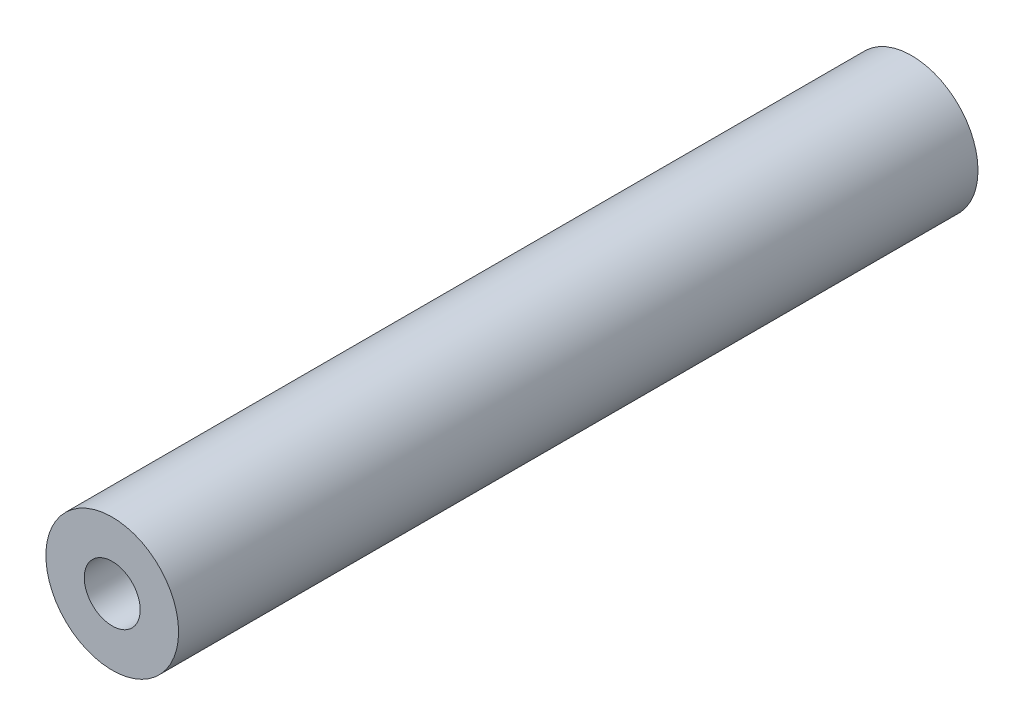
ISO-10303-21;
HEADER;
FILE_DESCRIPTION(('STEP AP214'),'2;1');
FILE_NAME('part.step','',(''),(''),'','','');
FILE_SCHEMA(('AUTOMOTIVE_DESIGN { 1 0 10303 214 1 1 1 1 }'));
ENDSEC;
DATA;
#1=APPLICATION_CONTEXT('core data for automotive mechanical design processes');
#2=APPLICATION_PROTOCOL_DEFINITION('international standard','automotive_design',2000,#1);
#3=PRODUCT_CONTEXT('',#1,'mechanical');
#4=PRODUCT('Part','Part','',(#3));
#5=PRODUCT_RELATED_PRODUCT_CATEGORY('part','',(#4));
#6=PRODUCT_DEFINITION_FORMATION('','',#4);
#7=PRODUCT_DEFINITION_CONTEXT('part definition',#1,'design');
#8=PRODUCT_DEFINITION('design','',#6,#7);
#9=PRODUCT_DEFINITION_SHAPE('','',#8);
#10=(LENGTH_UNIT() NAMED_UNIT(*) SI_UNIT(.MILLI.,.METRE.));
#11=(NAMED_UNIT(*) PLANE_ANGLE_UNIT() SI_UNIT($,.RADIAN.));
#12=(NAMED_UNIT(*) SI_UNIT($,.STERADIAN.) SOLID_ANGLE_UNIT());
#13=UNCERTAINTY_MEASURE_WITH_UNIT(LENGTH_MEASURE(1.E-05),#10,'distance_accuracy_value','');
#14=(GEOMETRIC_REPRESENTATION_CONTEXT(3) GLOBAL_UNCERTAINTY_ASSIGNED_CONTEXT((#13)) GLOBAL_UNIT_ASSIGNED_CONTEXT((#10,
#11,#12)) REPRESENTATION_CONTEXT('',''));
#15=CARTESIAN_POINT('',(0.,0.,0.));
#16=DIRECTION('',(0.,0.,1.));
#17=DIRECTION('',(1.,0.,0.));
#18=AXIS2_PLACEMENT_3D('',#15,#16,#17);
#19=CARTESIAN_POINT('',(0.,0.,-2.));
#20=DIRECTION('',(0.,0.,1.));
#21=DIRECTION('',(1.,0.,0.));
#22=AXIS2_PLACEMENT_3D('',#19,#20,#21);
#23=CYLINDRICAL_SURFACE('',#22,0.875);
#24=CARTESIAN_POINT('',(0.,0.,-2.));
#25=DIRECTION('',(0.,0.,1.));
#26=DIRECTION('',(1.,0.,0.));
#27=AXIS2_PLACEMENT_3D('',#24,#25,#26);
#28=CIRCLE('',#27,0.875);
#29=CARTESIAN_POINT('',(0.875,0.,-2.));
#30=VERTEX_POINT('',#29);
#31=EDGE_CURVE('E11',#30,#30,#28,.T.);
#32=ORIENTED_EDGE('',*,*,#31,.T.);
#33=EDGE_LOOP('',(#32));
#34=FACE_BOUND('',#33,.T.);
#35=CARTESIAN_POINT('',(0.,0.,2.));
#36=DIRECTION('',(0.,0.,1.));
#37=DIRECTION('',(1.,0.,0.));
#38=AXIS2_PLACEMENT_3D('',#35,#36,#37);
#39=CIRCLE('',#38,0.875);
#40=CARTESIAN_POINT('',(0.875,0.,2.));
#41=VERTEX_POINT('',#40);
#42=EDGE_CURVE('E60',#41,#41,#39,.T.);
#43=ORIENTED_EDGE('',*,*,#42,.F.);
#44=EDGE_LOOP('',(#43));
#45=FACE_BOUND('',#44,.T.);
#46=ADVANCED_FACE('F50',(#34,#45),#23,.T.);
#47=CARTESIAN_POINT('',(0.,0.,-2.));
#48=DIRECTION('',(0.,0.,1.));
#49=DIRECTION('',(1.,0.,0.));
#50=AXIS2_PLACEMENT_3D('',#47,#48,#49);
#51=PLANE('',#50);
#52=CARTESIAN_POINT('',(0.,0.,-2.));
#53=DIRECTION('',(0.,0.,1.));
#54=DIRECTION('',(1.,0.,0.));
#55=AXIS2_PLACEMENT_3D('',#52,#53,#54);
#56=CIRCLE('',#55,0.4375);
#57=CARTESIAN_POINT('',(0.4375,0.,-2.));
#58=VERTEX_POINT('',#57);
#59=EDGE_CURVE('E56',#58,#58,#56,.T.);
#60=ORIENTED_EDGE('',*,*,#59,.T.);
#61=EDGE_LOOP('',(#60));
#62=FACE_BOUND('',#61,.T.);
#63=ORIENTED_EDGE('',*,*,#31,.F.);
#64=EDGE_LOOP('',(#63));
#65=FACE_BOUND('',#64,.T.);
#66=ADVANCED_FACE('F79',(#62,#65),#51,.F.);
#67=CARTESIAN_POINT('',(0.,0.,-2.));
#68=DIRECTION('',(0.,0.,1.));
#69=DIRECTION('',(1.,0.,0.));
#70=AXIS2_PLACEMENT_3D('',#67,#68,#69);
#71=CYLINDRICAL_SURFACE('',#70,0.4375);
#72=ORIENTED_EDGE('',*,*,#59,.F.);
#73=EDGE_LOOP('',(#72));
#74=FACE_BOUND('',#73,.T.);
#75=CARTESIAN_POINT('',(0.,0.,2.));
#76=DIRECTION('',(0.,0.,1.));
#77=DIRECTION('',(1.,0.,0.));
#78=AXIS2_PLACEMENT_3D('',#75,#76,#77);
#79=CIRCLE('',#78,0.4375);
#80=CARTESIAN_POINT('',(0.4375,0.,2.));
#81=VERTEX_POINT('',#80);
#82=EDGE_CURVE('E64',#81,#81,#79,.T.);
#83=ORIENTED_EDGE('',*,*,#82,.T.);
#84=EDGE_LOOP('',(#83));
#85=FACE_BOUND('',#84,.T.);
#86=ADVANCED_FACE('F70',(#74,#85),#71,.F.);
#87=CARTESIAN_POINT('',(0.,0.,2.));
#88=DIRECTION('',(0.,0.,1.));
#89=DIRECTION('',(1.,0.,0.));
#90=AXIS2_PLACEMENT_3D('',#87,#88,#89);
#91=PLANE('',#90);
#92=ORIENTED_EDGE('',*,*,#42,.T.);
#93=EDGE_LOOP('',(#92));
#94=FACE_BOUND('',#93,.T.);
#95=ORIENTED_EDGE('',*,*,#82,.F.);
#96=EDGE_LOOP('',(#95));
#97=FACE_BOUND('',#96,.T.);
#98=ADVANCED_FACE('F72',(#94,#97),#91,.T.);
#99=CLOSED_SHELL('',(#46,#66,#86,#98));
#100=MANIFOLD_SOLID_BREP('B2_NOT_SHOWN',#99);
#101=CARTESIAN_POINT('',(0.,0.,-12.5));
#102=DIRECTION('',(0.,0.,1.));
#103=DIRECTION('',(1.,0.,0.));
#104=AXIS2_PLACEMENT_3D('',#101,#102,#103);
#105=CYLINDRICAL_SURFACE('',#104,2.075);
#106=CARTESIAN_POINT('',(0.,0.,-12.5));
#107=DIRECTION('',(0.,0.,1.));
#108=DIRECTION('',(1.,0.,0.));
#109=AXIS2_PLACEMENT_3D('',#106,#107,#108);
#110=CIRCLE('',#109,2.075);
#111=CARTESIAN_POINT('',(2.075,0.,-12.5));
#112=VERTEX_POINT('',#111);
#113=EDGE_CURVE('E49',#112,#112,#110,.T.);
#114=ORIENTED_EDGE('',*,*,#113,.T.);
#115=EDGE_LOOP('',(#114));
#116=FACE_BOUND('',#115,.T.);
#117=CARTESIAN_POINT('',(0.,0.,12.5));
#118=DIRECTION('',(0.,0.,1.));
#119=DIRECTION('',(1.,0.,0.));
#120=AXIS2_PLACEMENT_3D('',#117,#118,#119);
#121=CIRCLE('',#120,2.075);
#122=CARTESIAN_POINT('',(2.075,0.,12.5));
#123=VERTEX_POINT('',#122);
#124=EDGE_CURVE('E131',#123,#123,#121,.T.);
#125=ORIENTED_EDGE('',*,*,#124,.F.);
#126=EDGE_LOOP('',(#125));
#127=FACE_BOUND('',#126,.T.);
#128=ADVANCED_FACE('F118',(#116,#127),#105,.T.);
#129=CARTESIAN_POINT('',(0.,0.,-12.5));
#130=DIRECTION('',(0.,0.,1.));
#131=DIRECTION('',(1.,0.,0.));
#132=AXIS2_PLACEMENT_3D('',#129,#130,#131);
#133=PLANE('',#132);
#134=CARTESIAN_POINT('',(0.,0.,-12.5));
#135=DIRECTION('',(0.,0.,1.));
#136=DIRECTION('',(1.,0.,0.));
#137=AXIS2_PLACEMENT_3D('',#134,#135,#136);
#138=CIRCLE('',#137,0.875);
#139=CARTESIAN_POINT('',(0.875,0.,-12.5));
#140=VERTEX_POINT('',#139);
#141=EDGE_CURVE('E126',#140,#140,#138,.T.);
#142=ORIENTED_EDGE('',*,*,#141,.T.);
#143=EDGE_LOOP('',(#142));
#144=FACE_BOUND('',#143,.T.);
#145=ORIENTED_EDGE('',*,*,#113,.F.);
#146=EDGE_LOOP('',(#145));
#147=FACE_BOUND('',#146,.T.);
#148=ADVANCED_FACE('F154',(#144,#147),#133,.F.);
#149=CARTESIAN_POINT('',(0.,0.,-12.5));
#150=DIRECTION('',(0.,0.,1.));
#151=DIRECTION('',(1.,0.,0.));
#152=AXIS2_PLACEMENT_3D('',#149,#150,#151);
#153=CYLINDRICAL_SURFACE('',#152,0.875);
#154=ORIENTED_EDGE('',*,*,#141,.F.);
#155=EDGE_LOOP('',(#154));
#156=FACE_BOUND('',#155,.T.);
#157=CARTESIAN_POINT('',(0.,0.,12.5));
#158=DIRECTION('',(0.,0.,1.));
#159=DIRECTION('',(1.,0.,0.));
#160=AXIS2_PLACEMENT_3D('',#157,#158,#159);
#161=CIRCLE('',#160,0.875);
#162=CARTESIAN_POINT('',(0.875,0.,12.5));
#163=VERTEX_POINT('',#162);
#164=EDGE_CURVE('E136',#163,#163,#161,.T.);
#165=ORIENTED_EDGE('',*,*,#164,.T.);
#166=EDGE_LOOP('',(#165));
#167=FACE_BOUND('',#166,.T.);
#168=ADVANCED_FACE('F145',(#156,#167),#153,.F.);
#169=CARTESIAN_POINT('',(0.,0.,12.5));
#170=DIRECTION('',(0.,0.,1.));
#171=DIRECTION('',(1.,0.,0.));
#172=AXIS2_PLACEMENT_3D('',#169,#170,#171);
#173=PLANE('',#172);
#174=ORIENTED_EDGE('',*,*,#124,.T.);
#175=EDGE_LOOP('',(#174));
#176=FACE_BOUND('',#175,.T.);
#177=ORIENTED_EDGE('',*,*,#164,.F.);
#178=EDGE_LOOP('',(#177));
#179=FACE_BOUND('',#178,.T.);
#180=ADVANCED_FACE('F147',(#176,#179),#173,.T.);
#181=CLOSED_SHELL('',(#128,#148,#168,#180));
#182=MANIFOLD_SOLID_BREP('B6',#181);
#183=ADVANCED_BREP_SHAPE_REPRESENTATION('',(#18,#100,#182),#14);
#184=SHAPE_DEFINITION_REPRESENTATION(#9,#183);
ENDSEC;
END-ISO-10303-21;
